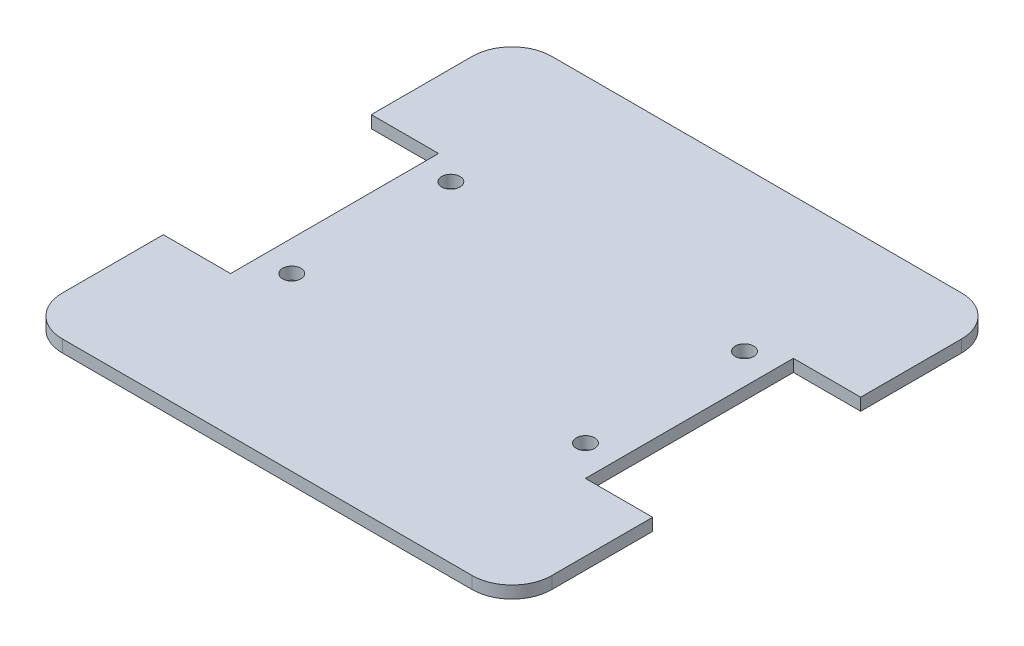
ISO-10303-21;
HEADER;
FILE_DESCRIPTION(('STEP AP214'),'2;1');
FILE_NAME('part.step','',(''),(''),'','','');
FILE_SCHEMA(('AUTOMOTIVE_DESIGN { 1 0 10303 214 1 1 1 1 }'));
ENDSEC;
DATA;
#1=APPLICATION_CONTEXT('core data for automotive mechanical design processes');
#2=APPLICATION_PROTOCOL_DEFINITION('international standard','automotive_design',2000,#1);
#3=PRODUCT_CONTEXT('',#1,'mechanical');
#4=PRODUCT('Part','Part','',(#3));
#5=PRODUCT_RELATED_PRODUCT_CATEGORY('part','',(#4));
#6=PRODUCT_DEFINITION_FORMATION('','',#4);
#7=PRODUCT_DEFINITION_CONTEXT('part definition',#1,'design');
#8=PRODUCT_DEFINITION('design','',#6,#7);
#9=PRODUCT_DEFINITION_SHAPE('','',#8);
#10=(LENGTH_UNIT() NAMED_UNIT(*) SI_UNIT(.MILLI.,.METRE.));
#11=(NAMED_UNIT(*) PLANE_ANGLE_UNIT() SI_UNIT($,.RADIAN.));
#12=(NAMED_UNIT(*) SI_UNIT($,.STERADIAN.) SOLID_ANGLE_UNIT());
#13=UNCERTAINTY_MEASURE_WITH_UNIT(LENGTH_MEASURE(1.E-05),#10,'distance_accuracy_value','');
#14=(GEOMETRIC_REPRESENTATION_CONTEXT(3) GLOBAL_UNCERTAINTY_ASSIGNED_CONTEXT((#13)) GLOBAL_UNIT_ASSIGNED_CONTEXT((#10,
#11,#12)) REPRESENTATION_CONTEXT('',''));
#15=CARTESIAN_POINT('',(0.,0.,0.));
#16=DIRECTION('',(0.,0.,1.));
#17=DIRECTION('',(1.,0.,0.));
#18=AXIS2_PLACEMENT_3D('',#15,#16,#17);
#19=CARTESIAN_POINT('',(6.5,2.,-6.5));
#20=DIRECTION('',(0.,-1.,0.));
#21=DIRECTION('',(0.,0.,-1.));
#22=AXIS2_PLACEMENT_3D('',#19,#20,#21);
#23=PLANE('',#22);
#24=CARTESIAN_POINT('',(6.5,2.,-6.5));
#25=DIRECTION('',(0.,1.,0.));
#26=DIRECTION('',(0.,0.,-1.));
#27=AXIS2_PLACEMENT_3D('',#24,#25,#26);
#28=CIRCLE('',#27,6.5);
#29=CARTESIAN_POINT('',(0.,2.,-6.50000000000005));
#30=VERTEX_POINT('',#29);
#31=CARTESIAN_POINT('',(6.50000000000005,2.,0.));
#32=VERTEX_POINT('',#31);
#33=EDGE_CURVE('E238',#30,#32,#28,.T.);
#34=ORIENTED_EDGE('',*,*,#33,.T.);
#35=DIRECTION('',(1.,0.,0.));
#36=VECTOR('',#35,1.);
#37=CARTESIAN_POINT('',(6.50000000000005,2.,0.));
#38=LINE('',#37,#36);
#39=CARTESIAN_POINT('',(73.5,2.,0.));
#40=VERTEX_POINT('',#39);
#41=EDGE_CURVE('E126',#32,#40,#38,.T.);
#42=ORIENTED_EDGE('',*,*,#41,.T.);
#43=CARTESIAN_POINT('',(73.5,2.,-6.5));
#44=DIRECTION('',(0.,1.,0.));
#45=DIRECTION('',(0.,0.,-1.));
#46=AXIS2_PLACEMENT_3D('',#43,#44,#45);
#47=CIRCLE('',#46,6.5);
#48=CARTESIAN_POINT('',(80.,2.,-6.50000000000005));
#49=VERTEX_POINT('',#48);
#50=EDGE_CURVE('E291',#40,#49,#47,.T.);
#51=ORIENTED_EDGE('',*,*,#50,.T.);
#52=DIRECTION('',(0.,0.,-1.));
#53=VECTOR('',#52,1.);
#54=CARTESIAN_POINT('',(80.,2.,-6.50000000000005));
#55=LINE('',#54,#53);
#56=CARTESIAN_POINT('',(80.,2.,-23.));
#57=VERTEX_POINT('',#56);
#58=EDGE_CURVE('E311',#49,#57,#55,.T.);
#59=ORIENTED_EDGE('',*,*,#58,.T.);
#60=DIRECTION('',(-1.,0.,0.));
#61=VECTOR('',#60,1.);
#62=CARTESIAN_POINT('',(69.,2.,-23.));
#63=LINE('',#62,#61);
#64=CARTESIAN_POINT('',(69.,2.,-23.));
#65=VERTEX_POINT('',#64);
#66=EDGE_CURVE('E307',#57,#65,#63,.T.);
#67=ORIENTED_EDGE('',*,*,#66,.T.);
#68=DIRECTION('',(0.,0.,-1.));
#69=VECTOR('',#68,1.);
#70=CARTESIAN_POINT('',(69.,2.,-23.));
#71=LINE('',#70,#69);
#72=CARTESIAN_POINT('',(69.,2.,-57.));
#73=VERTEX_POINT('',#72);
#74=EDGE_CURVE('E310',#65,#73,#71,.T.);
#75=ORIENTED_EDGE('',*,*,#74,.T.);
#76=DIRECTION('',(1.,0.,0.));
#77=VECTOR('',#76,1.);
#78=CARTESIAN_POINT('',(69.,2.,-57.));
#79=LINE('',#78,#77);
#80=CARTESIAN_POINT('',(80.,2.,-57.));
#81=VERTEX_POINT('',#80);
#82=EDGE_CURVE('E315',#73,#81,#79,.T.);
#83=ORIENTED_EDGE('',*,*,#82,.T.);
#84=DIRECTION('',(0.,0.,-1.));
#85=VECTOR('',#84,1.);
#86=CARTESIAN_POINT('',(80.,2.,-57.));
#87=LINE('',#86,#85);
#88=CARTESIAN_POINT('',(80.,2.,-73.5));
#89=VERTEX_POINT('',#88);
#90=EDGE_CURVE('E322',#81,#89,#87,.T.);
#91=ORIENTED_EDGE('',*,*,#90,.T.);
#92=CARTESIAN_POINT('',(73.5,2.,-73.5));
#93=DIRECTION('',(0.,1.,0.));
#94=DIRECTION('',(0.,0.,-1.));
#95=AXIS2_PLACEMENT_3D('',#92,#93,#94);
#96=CIRCLE('',#95,6.5);
#97=CARTESIAN_POINT('',(73.5,2.,-80.));
#98=VERTEX_POINT('',#97);
#99=EDGE_CURVE('E325',#89,#98,#96,.T.);
#100=ORIENTED_EDGE('',*,*,#99,.T.);
#101=DIRECTION('',(-1.,0.,0.));
#102=VECTOR('',#101,1.);
#103=CARTESIAN_POINT('',(73.5,2.,-80.));
#104=LINE('',#103,#102);
#105=CARTESIAN_POINT('',(6.50000000000005,2.,-80.));
#106=VERTEX_POINT('',#105);
#107=EDGE_CURVE('E328',#98,#106,#104,.T.);
#108=ORIENTED_EDGE('',*,*,#107,.T.);
#109=CARTESIAN_POINT('',(6.50000000000001,2.,-73.5));
#110=DIRECTION('',(0.,1.,0.));
#111=DIRECTION('',(0.,0.,1.));
#112=AXIS2_PLACEMENT_3D('',#109,#110,#111);
#113=CIRCLE('',#112,6.5);
#114=CARTESIAN_POINT('',(0.,2.,-73.4999999999999));
#115=VERTEX_POINT('',#114);
#116=EDGE_CURVE('E331',#106,#115,#113,.T.);
#117=ORIENTED_EDGE('',*,*,#116,.T.);
#118=DIRECTION('',(0.,0.,1.));
#119=VECTOR('',#118,1.);
#120=CARTESIAN_POINT('',(0.,2.,-73.4999999999999));
#121=LINE('',#120,#119);
#122=CARTESIAN_POINT('',(0.,2.,-57.));
#123=VERTEX_POINT('',#122);
#124=EDGE_CURVE('E334',#115,#123,#121,.T.);
#125=ORIENTED_EDGE('',*,*,#124,.T.);
#126=DIRECTION('',(1.,0.,0.));
#127=VECTOR('',#126,1.);
#128=CARTESIAN_POINT('',(11.,2.,-57.));
#129=LINE('',#128,#127);
#130=CARTESIAN_POINT('',(11.,2.,-57.));
#131=VERTEX_POINT('',#130);
#132=EDGE_CURVE('E169',#123,#131,#129,.T.);
#133=ORIENTED_EDGE('',*,*,#132,.T.);
#134=DIRECTION('',(0.,0.,1.));
#135=VECTOR('',#134,1.);
#136=CARTESIAN_POINT('',(11.,2.,-23.));
#137=LINE('',#136,#135);
#138=CARTESIAN_POINT('',(11.,2.,-23.));
#139=VERTEX_POINT('',#138);
#140=EDGE_CURVE('E163',#131,#139,#137,.T.);
#141=ORIENTED_EDGE('',*,*,#140,.T.);
#142=DIRECTION('',(-1.,0.,0.));
#143=VECTOR('',#142,1.);
#144=CARTESIAN_POINT('',(11.,2.,-23.));
#145=LINE('',#144,#143);
#146=CARTESIAN_POINT('',(0.,2.,-23.));
#147=VERTEX_POINT('',#146);
#148=EDGE_CURVE('E167',#139,#147,#145,.T.);
#149=ORIENTED_EDGE('',*,*,#148,.T.);
#150=DIRECTION('',(0.,0.,1.));
#151=VECTOR('',#150,1.);
#152=CARTESIAN_POINT('',(0.,2.,-23.));
#153=LINE('',#152,#151);
#154=EDGE_CURVE('E59',#147,#30,#153,.T.);
#155=ORIENTED_EDGE('',*,*,#154,.T.);
#156=EDGE_LOOP('',(#34,#42,#51,#59,#67,#75,#83,#91,#100,#108,#117,#125,#133,#141,#149,#155));
#157=FACE_BOUND('',#156,.T.);
#158=CARTESIAN_POINT('',(16.,2.,-54.));
#159=DIRECTION('',(0.,1.,0.));
#160=DIRECTION('',(0.,0.,1.));
#161=AXIS2_PLACEMENT_3D('',#158,#159,#160);
#162=CIRCLE('',#161,1.5);
#163=CARTESIAN_POINT('',(16.,2.,-52.5));
#164=VERTEX_POINT('',#163);
#165=EDGE_CURVE('E196',#164,#164,#162,.T.);
#166=ORIENTED_EDGE('',*,*,#165,.F.);
#167=EDGE_LOOP('',(#166));
#168=FACE_BOUND('',#167,.T.);
#169=CARTESIAN_POINT('',(16.,2.,-28.));
#170=DIRECTION('',(0.,1.,0.));
#171=DIRECTION('',(0.,0.,1.));
#172=AXIS2_PLACEMENT_3D('',#169,#170,#171);
#173=CIRCLE('',#172,1.5);
#174=CARTESIAN_POINT('',(16.,2.,-26.5));
#175=VERTEX_POINT('',#174);
#176=EDGE_CURVE('E404',#175,#175,#173,.T.);
#177=ORIENTED_EDGE('',*,*,#176,.F.);
#178=EDGE_LOOP('',(#177));
#179=FACE_BOUND('',#178,.T.);
#180=CARTESIAN_POINT('',(64.,2.,-28.));
#181=DIRECTION('',(0.,1.,0.));
#182=DIRECTION('',(0.,0.,-1.));
#183=AXIS2_PLACEMENT_3D('',#180,#181,#182);
#184=CIRCLE('',#183,1.50000000000001);
#185=CARTESIAN_POINT('',(64.,2.,-29.5));
#186=VERTEX_POINT('',#185);
#187=EDGE_CURVE('E396',#186,#186,#184,.T.);
#188=ORIENTED_EDGE('',*,*,#187,.F.);
#189=EDGE_LOOP('',(#188));
#190=FACE_BOUND('',#189,.T.);
#191=CARTESIAN_POINT('',(64.,2.,-54.));
#192=DIRECTION('',(0.,1.,0.));
#193=DIRECTION('',(0.,0.,-1.));
#194=AXIS2_PLACEMENT_3D('',#191,#192,#193);
#195=CIRCLE('',#194,1.5);
#196=CARTESIAN_POINT('',(64.,2.,-55.5));
#197=VERTEX_POINT('',#196);
#198=EDGE_CURVE('E385',#197,#197,#195,.T.);
#199=ORIENTED_EDGE('',*,*,#198,.F.);
#200=EDGE_LOOP('',(#199));
#201=FACE_BOUND('',#200,.T.);
#202=ADVANCED_FACE('F41',(#157,#168,#179,#190,#201),#23,.F.);
#203=CARTESIAN_POINT('',(6.5,0.,-6.5));
#204=DIRECTION('',(0.,-1.,0.));
#205=DIRECTION('',(0.,0.,-1.));
#206=AXIS2_PLACEMENT_3D('',#203,#204,#205);
#207=PLANE('',#206);
#208=CARTESIAN_POINT('',(64.,0.,-28.));
#209=DIRECTION('',(0.,1.,0.));
#210=DIRECTION('',(0.,0.,-1.));
#211=AXIS2_PLACEMENT_3D('',#208,#209,#210);
#212=CIRCLE('',#211,1.50000000000001);
#213=CARTESIAN_POINT('',(64.,0.,-29.5));
#214=VERTEX_POINT('',#213);
#215=EDGE_CURVE('E393',#214,#214,#212,.T.);
#216=ORIENTED_EDGE('',*,*,#215,.T.);
#217=EDGE_LOOP('',(#216));
#218=FACE_BOUND('',#217,.T.);
#219=CARTESIAN_POINT('',(16.,0.,-54.));
#220=DIRECTION('',(0.,1.,0.));
#221=DIRECTION('',(0.,0.,1.));
#222=AXIS2_PLACEMENT_3D('',#219,#220,#221);
#223=CIRCLE('',#222,1.5);
#224=CARTESIAN_POINT('',(16.,0.,-52.5));
#225=VERTEX_POINT('',#224);
#226=EDGE_CURVE('E408',#225,#225,#223,.T.);
#227=ORIENTED_EDGE('',*,*,#226,.T.);
#228=EDGE_LOOP('',(#227));
#229=FACE_BOUND('',#228,.T.);
#230=CARTESIAN_POINT('',(6.5,0.,-6.5));
#231=DIRECTION('',(0.,1.,0.));
#232=DIRECTION('',(0.,0.,-1.));
#233=AXIS2_PLACEMENT_3D('',#230,#231,#232);
#234=CIRCLE('',#233,6.5);
#235=CARTESIAN_POINT('',(0.,0.,-6.50000000000005));
#236=VERTEX_POINT('',#235);
#237=CARTESIAN_POINT('',(6.50000000000005,0.,0.));
#238=VERTEX_POINT('',#237);
#239=EDGE_CURVE('E191',#236,#238,#234,.T.);
#240=ORIENTED_EDGE('',*,*,#239,.F.);
#241=DIRECTION('',(0.,0.,1.));
#242=VECTOR('',#241,1.);
#243=CARTESIAN_POINT('',(0.,0.,-23.));
#244=LINE('',#243,#242);
#245=CARTESIAN_POINT('',(0.,0.,-23.));
#246=VERTEX_POINT('',#245);
#247=EDGE_CURVE('E118',#246,#236,#244,.T.);
#248=ORIENTED_EDGE('',*,*,#247,.F.);
#249=DIRECTION('',(-1.,0.,0.));
#250=VECTOR('',#249,1.);
#251=CARTESIAN_POINT('',(11.,0.,-23.));
#252=LINE('',#251,#250);
#253=CARTESIAN_POINT('',(11.,0.,-23.));
#254=VERTEX_POINT('',#253);
#255=EDGE_CURVE('E112',#254,#246,#252,.T.);
#256=ORIENTED_EDGE('',*,*,#255,.F.);
#257=DIRECTION('',(0.,0.,1.));
#258=VECTOR('',#257,1.);
#259=CARTESIAN_POINT('',(11.,0.,-23.));
#260=LINE('',#259,#258);
#261=CARTESIAN_POINT('',(11.,0.,-57.));
#262=VERTEX_POINT('',#261);
#263=EDGE_CURVE('E178',#262,#254,#260,.T.);
#264=ORIENTED_EDGE('',*,*,#263,.F.);
#265=DIRECTION('',(1.,0.,0.));
#266=VECTOR('',#265,1.);
#267=CARTESIAN_POINT('',(11.,0.,-57.));
#268=LINE('',#267,#266);
#269=CARTESIAN_POINT('',(0.,0.,-57.));
#270=VERTEX_POINT('',#269);
#271=EDGE_CURVE('E229',#270,#262,#268,.T.);
#272=ORIENTED_EDGE('',*,*,#271,.F.);
#273=DIRECTION('',(0.,0.,1.));
#274=VECTOR('',#273,1.);
#275=CARTESIAN_POINT('',(0.,0.,-73.4999999999999));
#276=LINE('',#275,#274);
#277=CARTESIAN_POINT('',(0.,0.,-73.4999999999999));
#278=VERTEX_POINT('',#277);
#279=EDGE_CURVE('E226',#278,#270,#276,.T.);
#280=ORIENTED_EDGE('',*,*,#279,.F.);
#281=CARTESIAN_POINT('',(6.50000000000001,0.,-73.5));
#282=DIRECTION('',(0.,1.,0.));
#283=DIRECTION('',(0.,0.,1.));
#284=AXIS2_PLACEMENT_3D('',#281,#282,#283);
#285=CIRCLE('',#284,6.5);
#286=CARTESIAN_POINT('',(6.50000000000005,0.,-80.));
#287=VERTEX_POINT('',#286);
#288=EDGE_CURVE('E223',#287,#278,#285,.T.);
#289=ORIENTED_EDGE('',*,*,#288,.F.);
#290=DIRECTION('',(-1.,0.,0.));
#291=VECTOR('',#290,1.);
#292=CARTESIAN_POINT('',(73.5,0.,-80.));
#293=LINE('',#292,#291);
#294=CARTESIAN_POINT('',(73.5,0.,-80.));
#295=VERTEX_POINT('',#294);
#296=EDGE_CURVE('E220',#295,#287,#293,.T.);
#297=ORIENTED_EDGE('',*,*,#296,.F.);
#298=CARTESIAN_POINT('',(73.5,0.,-73.5));
#299=DIRECTION('',(0.,1.,0.));
#300=DIRECTION('',(0.,0.,-1.));
#301=AXIS2_PLACEMENT_3D('',#298,#299,#300);
#302=CIRCLE('',#301,6.5);
#303=CARTESIAN_POINT('',(80.,0.,-73.5));
#304=VERTEX_POINT('',#303);
#305=EDGE_CURVE('E217',#304,#295,#302,.T.);
#306=ORIENTED_EDGE('',*,*,#305,.F.);
#307=DIRECTION('',(0.,0.,-1.));
#308=VECTOR('',#307,1.);
#309=CARTESIAN_POINT('',(80.,0.,-57.));
#310=LINE('',#309,#308);
#311=CARTESIAN_POINT('',(80.,0.,-57.));
#312=VERTEX_POINT('',#311);
#313=EDGE_CURVE('E214',#312,#304,#310,.T.);
#314=ORIENTED_EDGE('',*,*,#313,.F.);
#315=DIRECTION('',(1.,0.,0.));
#316=VECTOR('',#315,1.);
#317=CARTESIAN_POINT('',(69.,0.,-57.));
#318=LINE('',#317,#316);
#319=CARTESIAN_POINT('',(69.,0.,-57.));
#320=VERTEX_POINT('',#319);
#321=EDGE_CURVE('E211',#320,#312,#318,.T.);
#322=ORIENTED_EDGE('',*,*,#321,.F.);
#323=DIRECTION('',(0.,0.,-1.));
#324=VECTOR('',#323,1.);
#325=CARTESIAN_POINT('',(69.,0.,-23.));
#326=LINE('',#325,#324);
#327=CARTESIAN_POINT('',(69.,0.,-23.));
#328=VERTEX_POINT('',#327);
#329=EDGE_CURVE('E208',#328,#320,#326,.T.);
#330=ORIENTED_EDGE('',*,*,#329,.F.);
#331=DIRECTION('',(-1.,0.,0.));
#332=VECTOR('',#331,1.);
#333=CARTESIAN_POINT('',(69.,0.,-23.));
#334=LINE('',#333,#332);
#335=CARTESIAN_POINT('',(80.,0.,-23.));
#336=VERTEX_POINT('',#335);
#337=EDGE_CURVE('E205',#336,#328,#334,.T.);
#338=ORIENTED_EDGE('',*,*,#337,.F.);
#339=DIRECTION('',(0.,0.,-1.));
#340=VECTOR('',#339,1.);
#341=CARTESIAN_POINT('',(80.,0.,-6.50000000000005));
#342=LINE('',#341,#340);
#343=CARTESIAN_POINT('',(80.,0.,-6.50000000000005));
#344=VERTEX_POINT('',#343);
#345=EDGE_CURVE('E202',#344,#336,#342,.T.);
#346=ORIENTED_EDGE('',*,*,#345,.F.);
#347=CARTESIAN_POINT('',(73.5,0.,-6.5));
#348=DIRECTION('',(0.,1.,0.));
#349=DIRECTION('',(0.,0.,-1.));
#350=AXIS2_PLACEMENT_3D('',#347,#348,#349);
#351=CIRCLE('',#350,6.5);
#352=CARTESIAN_POINT('',(73.5,0.,0.));
#353=VERTEX_POINT('',#352);
#354=EDGE_CURVE('E199',#353,#344,#351,.T.);
#355=ORIENTED_EDGE('',*,*,#354,.F.);
#356=DIRECTION('',(1.,0.,0.));
#357=VECTOR('',#356,1.);
#358=CARTESIAN_POINT('',(6.50000000000005,0.,0.));
#359=LINE('',#358,#357);
#360=EDGE_CURVE('E195',#238,#353,#359,.T.);
#361=ORIENTED_EDGE('',*,*,#360,.F.);
#362=EDGE_LOOP('',(#240,#248,#256,#264,#272,#280,#289,#297,#306,#314,#322,#330,#338,#346,#355,#361));
#363=FACE_BOUND('',#362,.T.);
#364=CARTESIAN_POINT('',(16.,0.,-28.));
#365=DIRECTION('',(0.,1.,0.));
#366=DIRECTION('',(0.,0.,1.));
#367=AXIS2_PLACEMENT_3D('',#364,#365,#366);
#368=CIRCLE('',#367,1.5);
#369=CARTESIAN_POINT('',(16.,0.,-26.5));
#370=VERTEX_POINT('',#369);
#371=EDGE_CURVE('E400',#370,#370,#368,.T.);
#372=ORIENTED_EDGE('',*,*,#371,.T.);
#373=EDGE_LOOP('',(#372));
#374=FACE_BOUND('',#373,.T.);
#375=CARTESIAN_POINT('',(64.,0.,-54.));
#376=DIRECTION('',(0.,1.,0.));
#377=DIRECTION('',(0.,0.,-1.));
#378=AXIS2_PLACEMENT_3D('',#375,#376,#377);
#379=CIRCLE('',#378,1.5);
#380=CARTESIAN_POINT('',(64.,0.,-55.5));
#381=VERTEX_POINT('',#380);
#382=EDGE_CURVE('E388',#381,#381,#379,.T.);
#383=ORIENTED_EDGE('',*,*,#382,.T.);
#384=EDGE_LOOP('',(#383));
#385=FACE_BOUND('',#384,.T.);
#386=ADVANCED_FACE('F295',(#218,#229,#363,#374,#385),#207,.T.);
#387=CARTESIAN_POINT('',(6.5,2.,-6.5));
#388=DIRECTION('',(0.,-1.,0.));
#389=DIRECTION('',(0.,0.,-1.));
#390=AXIS2_PLACEMENT_3D('',#387,#388,#389);
#391=CYLINDRICAL_SURFACE('',#390,6.5);
#392=ORIENTED_EDGE('',*,*,#239,.T.);
#393=DIRECTION('',(0.,-1.,0.));
#394=VECTOR('',#393,1.);
#395=CARTESIAN_POINT('',(6.50000000000005,2.,0.));
#396=LINE('',#395,#394);
#397=EDGE_CURVE('E11',#32,#238,#396,.T.);
#398=ORIENTED_EDGE('',*,*,#397,.F.);
#399=ORIENTED_EDGE('',*,*,#33,.F.);
#400=DIRECTION('',(0.,-1.,0.));
#401=VECTOR('',#400,1.);
#402=CARTESIAN_POINT('',(0.,2.,-6.50000000000005));
#403=LINE('',#402,#401);
#404=EDGE_CURVE('E187',#30,#236,#403,.T.);
#405=ORIENTED_EDGE('',*,*,#404,.T.);
#406=EDGE_LOOP('',(#392,#398,#399,#405));
#407=FACE_BOUND('',#406,.T.);
#408=ADVANCED_FACE('F43',(#407),#391,.T.);
#409=CARTESIAN_POINT('',(6.50000000000005,2.,0.));
#410=DIRECTION('',(0.,0.,-1.));
#411=DIRECTION('',(-1.,0.,0.));
#412=AXIS2_PLACEMENT_3D('',#409,#410,#411);
#413=PLANE('',#412);
#414=ORIENTED_EDGE('',*,*,#360,.T.);
#415=DIRECTION('',(0.,-1.,0.));
#416=VECTOR('',#415,1.);
#417=CARTESIAN_POINT('',(73.5,2.,0.));
#418=LINE('',#417,#416);
#419=EDGE_CURVE('E51',#40,#353,#418,.T.);
#420=ORIENTED_EDGE('',*,*,#419,.F.);
#421=ORIENTED_EDGE('',*,*,#41,.F.);
#422=ORIENTED_EDGE('',*,*,#397,.T.);
#423=EDGE_LOOP('',(#414,#420,#421,#422));
#424=FACE_BOUND('',#423,.T.);
#425=ADVANCED_FACE('F566',(#424),#413,.F.);
#426=CARTESIAN_POINT('',(73.5,2.,-6.5));
#427=DIRECTION('',(0.,-1.,0.));
#428=DIRECTION('',(0.,0.,-1.));
#429=AXIS2_PLACEMENT_3D('',#426,#427,#428);
#430=CYLINDRICAL_SURFACE('',#429,6.5);
#431=ORIENTED_EDGE('',*,*,#354,.T.);
#432=DIRECTION('',(0.,-1.,0.));
#433=VECTOR('',#432,1.);
#434=CARTESIAN_POINT('',(80.,2.,-6.50000000000005));
#435=LINE('',#434,#433);
#436=EDGE_CURVE('E281',#49,#344,#435,.T.);
#437=ORIENTED_EDGE('',*,*,#436,.F.);
#438=ORIENTED_EDGE('',*,*,#50,.F.);
#439=ORIENTED_EDGE('',*,*,#419,.T.);
#440=EDGE_LOOP('',(#431,#437,#438,#439));
#441=FACE_BOUND('',#440,.T.);
#442=ADVANCED_FACE('F289',(#441),#430,.T.);
#443=CARTESIAN_POINT('',(80.,2.,-6.50000000000005));
#444=DIRECTION('',(-1.,0.,0.));
#445=DIRECTION('',(0.,0.,1.));
#446=AXIS2_PLACEMENT_3D('',#443,#444,#445);
#447=PLANE('',#446);
#448=ORIENTED_EDGE('',*,*,#345,.T.);
#449=DIRECTION('',(0.,-1.,0.));
#450=VECTOR('',#449,1.);
#451=CARTESIAN_POINT('',(80.,2.,-23.));
#452=LINE('',#451,#450);
#453=EDGE_CURVE('E277',#57,#336,#452,.T.);
#454=ORIENTED_EDGE('',*,*,#453,.F.);
#455=ORIENTED_EDGE('',*,*,#58,.F.);
#456=ORIENTED_EDGE('',*,*,#436,.T.);
#457=EDGE_LOOP('',(#448,#454,#455,#456));
#458=FACE_BOUND('',#457,.T.);
#459=ADVANCED_FACE('F301',(#458),#447,.F.);
#460=CARTESIAN_POINT('',(69.,2.,-23.));
#461=DIRECTION('',(0.,0.,1.));
#462=DIRECTION('',(1.,0.,0.));
#463=AXIS2_PLACEMENT_3D('',#460,#461,#462);
#464=PLANE('',#463);
#465=ORIENTED_EDGE('',*,*,#337,.T.);
#466=DIRECTION('',(0.,-1.,0.));
#467=VECTOR('',#466,1.);
#468=CARTESIAN_POINT('',(69.,2.,-23.));
#469=LINE('',#468,#467);
#470=EDGE_CURVE('E273',#65,#328,#469,.T.);
#471=ORIENTED_EDGE('',*,*,#470,.F.);
#472=ORIENTED_EDGE('',*,*,#66,.F.);
#473=ORIENTED_EDGE('',*,*,#453,.T.);
#474=EDGE_LOOP('',(#465,#471,#472,#473));
#475=FACE_BOUND('',#474,.T.);
#476=ADVANCED_FACE('F305',(#475),#464,.F.);
#477=CARTESIAN_POINT('',(69.,2.,-23.));
#478=DIRECTION('',(-1.,0.,0.));
#479=DIRECTION('',(0.,0.,1.));
#480=AXIS2_PLACEMENT_3D('',#477,#478,#479);
#481=PLANE('',#480);
#482=ORIENTED_EDGE('',*,*,#329,.T.);
#483=DIRECTION('',(0.,-1.,0.));
#484=VECTOR('',#483,1.);
#485=CARTESIAN_POINT('',(69.,2.,-57.));
#486=LINE('',#485,#484);
#487=EDGE_CURVE('E269',#73,#320,#486,.T.);
#488=ORIENTED_EDGE('',*,*,#487,.F.);
#489=ORIENTED_EDGE('',*,*,#74,.F.);
#490=ORIENTED_EDGE('',*,*,#470,.T.);
#491=EDGE_LOOP('',(#482,#488,#489,#490));
#492=FACE_BOUND('',#491,.T.);
#493=ADVANCED_FACE('F531',(#492),#481,.F.);
#494=CARTESIAN_POINT('',(69.,2.,-57.));
#495=DIRECTION('',(0.,0.,-1.));
#496=DIRECTION('',(-1.,0.,0.));
#497=AXIS2_PLACEMENT_3D('',#494,#495,#496);
#498=PLANE('',#497);
#499=ORIENTED_EDGE('',*,*,#321,.T.);
#500=DIRECTION('',(0.,-1.,0.));
#501=VECTOR('',#500,1.);
#502=CARTESIAN_POINT('',(80.,2.,-57.));
#503=LINE('',#502,#501);
#504=EDGE_CURVE('E265',#81,#312,#503,.T.);
#505=ORIENTED_EDGE('',*,*,#504,.F.);
#506=ORIENTED_EDGE('',*,*,#82,.F.);
#507=ORIENTED_EDGE('',*,*,#487,.T.);
#508=EDGE_LOOP('',(#499,#505,#506,#507));
#509=FACE_BOUND('',#508,.T.);
#510=ADVANCED_FACE('F521',(#509),#498,.F.);
#511=CARTESIAN_POINT('',(80.,2.,-57.));
#512=DIRECTION('',(-1.,0.,0.));
#513=DIRECTION('',(0.,0.,1.));
#514=AXIS2_PLACEMENT_3D('',#511,#512,#513);
#515=PLANE('',#514);
#516=ORIENTED_EDGE('',*,*,#313,.T.);
#517=DIRECTION('',(0.,-1.,0.));
#518=VECTOR('',#517,1.);
#519=CARTESIAN_POINT('',(80.,2.,-73.5));
#520=LINE('',#519,#518);
#521=EDGE_CURVE('E261',#89,#304,#520,.T.);
#522=ORIENTED_EDGE('',*,*,#521,.F.);
#523=ORIENTED_EDGE('',*,*,#90,.F.);
#524=ORIENTED_EDGE('',*,*,#504,.T.);
#525=EDGE_LOOP('',(#516,#522,#523,#524));
#526=FACE_BOUND('',#525,.T.);
#527=ADVANCED_FACE('F511',(#526),#515,.F.);
#528=CARTESIAN_POINT('',(73.5,2.,-73.5));
#529=DIRECTION('',(0.,-1.,0.));
#530=DIRECTION('',(0.,0.,-1.));
#531=AXIS2_PLACEMENT_3D('',#528,#529,#530);
#532=CYLINDRICAL_SURFACE('',#531,6.5);
#533=ORIENTED_EDGE('',*,*,#305,.T.);
#534=DIRECTION('',(0.,-1.,0.));
#535=VECTOR('',#534,1.);
#536=CARTESIAN_POINT('',(73.5,2.,-80.));
#537=LINE('',#536,#535);
#538=EDGE_CURVE('E257',#98,#295,#537,.T.);
#539=ORIENTED_EDGE('',*,*,#538,.F.);
#540=ORIENTED_EDGE('',*,*,#99,.F.);
#541=ORIENTED_EDGE('',*,*,#521,.T.);
#542=EDGE_LOOP('',(#533,#539,#540,#541));
#543=FACE_BOUND('',#542,.T.);
#544=ADVANCED_FACE('F501',(#543),#532,.T.);
#545=CARTESIAN_POINT('',(73.5,2.,-80.));
#546=DIRECTION('',(0.,0.,1.));
#547=DIRECTION('',(1.,0.,0.));
#548=AXIS2_PLACEMENT_3D('',#545,#546,#547);
#549=PLANE('',#548);
#550=ORIENTED_EDGE('',*,*,#296,.T.);
#551=DIRECTION('',(0.,-1.,0.));
#552=VECTOR('',#551,1.);
#553=CARTESIAN_POINT('',(6.50000000000005,2.,-80.));
#554=LINE('',#553,#552);
#555=EDGE_CURVE('E253',#106,#287,#554,.T.);
#556=ORIENTED_EDGE('',*,*,#555,.F.);
#557=ORIENTED_EDGE('',*,*,#107,.F.);
#558=ORIENTED_EDGE('',*,*,#538,.T.);
#559=EDGE_LOOP('',(#550,#556,#557,#558));
#560=FACE_BOUND('',#559,.T.);
#561=ADVANCED_FACE('F491',(#560),#549,.F.);
#562=CARTESIAN_POINT('',(6.50000000000001,2.,-73.5));
#563=DIRECTION('',(0.,-1.,0.));
#564=DIRECTION('',(0.,0.,-1.));
#565=AXIS2_PLACEMENT_3D('',#562,#563,#564);
#566=CYLINDRICAL_SURFACE('',#565,6.5);
#567=ORIENTED_EDGE('',*,*,#288,.T.);
#568=DIRECTION('',(0.,-1.,0.));
#569=VECTOR('',#568,1.);
#570=CARTESIAN_POINT('',(0.,2.,-73.4999999999999));
#571=LINE('',#570,#569);
#572=EDGE_CURVE('E249',#115,#278,#571,.T.);
#573=ORIENTED_EDGE('',*,*,#572,.F.);
#574=ORIENTED_EDGE('',*,*,#116,.F.);
#575=ORIENTED_EDGE('',*,*,#555,.T.);
#576=EDGE_LOOP('',(#567,#573,#574,#575));
#577=FACE_BOUND('',#576,.T.);
#578=ADVANCED_FACE('F482',(#577),#566,.T.);
#579=CARTESIAN_POINT('',(0.,2.,-73.4999999999999));
#580=DIRECTION('',(1.,0.,0.));
#581=DIRECTION('',(0.,0.,-1.));
#582=AXIS2_PLACEMENT_3D('',#579,#580,#581);
#583=PLANE('',#582);
#584=ORIENTED_EDGE('',*,*,#279,.T.);
#585=DIRECTION('',(0.,-1.,0.));
#586=VECTOR('',#585,1.);
#587=CARTESIAN_POINT('',(0.,2.,-57.));
#588=LINE('',#587,#586);
#589=EDGE_CURVE('E245',#123,#270,#588,.T.);
#590=ORIENTED_EDGE('',*,*,#589,.F.);
#591=ORIENTED_EDGE('',*,*,#124,.F.);
#592=ORIENTED_EDGE('',*,*,#572,.T.);
#593=EDGE_LOOP('',(#584,#590,#591,#592));
#594=FACE_BOUND('',#593,.T.);
#595=ADVANCED_FACE('F342',(#594),#583,.F.);
#596=CARTESIAN_POINT('',(11.,2.,-57.));
#597=DIRECTION('',(0.,0.,-1.));
#598=DIRECTION('',(-1.,0.,0.));
#599=AXIS2_PLACEMENT_3D('',#596,#597,#598);
#600=PLANE('',#599);
#601=ORIENTED_EDGE('',*,*,#271,.T.);
#602=DIRECTION('',(0.,-1.,0.));
#603=VECTOR('',#602,1.);
#604=CARTESIAN_POINT('',(11.,2.,-57.));
#605=LINE('',#604,#603);
#606=EDGE_CURVE('E180',#131,#262,#605,.T.);
#607=ORIENTED_EDGE('',*,*,#606,.F.);
#608=ORIENTED_EDGE('',*,*,#132,.F.);
#609=ORIENTED_EDGE('',*,*,#589,.T.);
#610=EDGE_LOOP('',(#601,#607,#608,#609));
#611=FACE_BOUND('',#610,.T.);
#612=ADVANCED_FACE('F346',(#611),#600,.F.);
#613=CARTESIAN_POINT('',(11.,2.,-23.));
#614=DIRECTION('',(1.,0.,0.));
#615=DIRECTION('',(0.,0.,-1.));
#616=AXIS2_PLACEMENT_3D('',#613,#614,#615);
#617=PLANE('',#616);
#618=ORIENTED_EDGE('',*,*,#263,.T.);
#619=DIRECTION('',(0.,-1.,0.));
#620=VECTOR('',#619,1.);
#621=CARTESIAN_POINT('',(11.,2.,-23.));
#622=LINE('',#621,#620);
#623=EDGE_CURVE('E175',#139,#254,#622,.T.);
#624=ORIENTED_EDGE('',*,*,#623,.F.);
#625=ORIENTED_EDGE('',*,*,#140,.F.);
#626=ORIENTED_EDGE('',*,*,#606,.T.);
#627=EDGE_LOOP('',(#618,#624,#625,#626));
#628=FACE_BOUND('',#627,.T.);
#629=ADVANCED_FACE('F176',(#628),#617,.F.);
#630=CARTESIAN_POINT('',(11.,2.,-23.));
#631=DIRECTION('',(0.,0.,1.));
#632=DIRECTION('',(1.,0.,0.));
#633=AXIS2_PLACEMENT_3D('',#630,#631,#632);
#634=PLANE('',#633);
#635=ORIENTED_EDGE('',*,*,#255,.T.);
#636=DIRECTION('',(0.,-1.,0.));
#637=VECTOR('',#636,1.);
#638=CARTESIAN_POINT('',(0.,2.,-23.));
#639=LINE('',#638,#637);
#640=EDGE_CURVE('E181',#147,#246,#639,.T.);
#641=ORIENTED_EDGE('',*,*,#640,.F.);
#642=ORIENTED_EDGE('',*,*,#148,.F.);
#643=ORIENTED_EDGE('',*,*,#623,.T.);
#644=EDGE_LOOP('',(#635,#641,#642,#643));
#645=FACE_BOUND('',#644,.T.);
#646=ADVANCED_FACE('F183',(#645),#634,.F.);
#647=CARTESIAN_POINT('',(0.,2.,-23.));
#648=DIRECTION('',(1.,0.,0.));
#649=DIRECTION('',(0.,0.,-1.));
#650=AXIS2_PLACEMENT_3D('',#647,#648,#649);
#651=PLANE('',#650);
#652=ORIENTED_EDGE('',*,*,#247,.T.);
#653=ORIENTED_EDGE('',*,*,#404,.F.);
#654=ORIENTED_EDGE('',*,*,#154,.F.);
#655=ORIENTED_EDGE('',*,*,#640,.T.);
#656=EDGE_LOOP('',(#652,#653,#654,#655));
#657=FACE_BOUND('',#656,.T.);
#658=ADVANCED_FACE('F350',(#657),#651,.F.);
#659=CARTESIAN_POINT('',(16.,2.,-54.));
#660=DIRECTION('',(0.,-1.,0.));
#661=DIRECTION('',(0.,0.,-1.));
#662=AXIS2_PLACEMENT_3D('',#659,#660,#661);
#663=CYLINDRICAL_SURFACE('',#662,1.5);
#664=ORIENTED_EDGE('',*,*,#165,.T.);
#665=EDGE_LOOP('',(#664));
#666=FACE_BOUND('',#665,.T.);
#667=ORIENTED_EDGE('',*,*,#226,.F.);
#668=EDGE_LOOP('',(#667));
#669=FACE_BOUND('',#668,.T.);
#670=ADVANCED_FACE('F352',(#666,#669),#663,.F.);
#671=CARTESIAN_POINT('',(16.,2.,-28.));
#672=DIRECTION('',(0.,-1.,0.));
#673=DIRECTION('',(0.,0.,-1.));
#674=AXIS2_PLACEMENT_3D('',#671,#672,#673);
#675=CYLINDRICAL_SURFACE('',#674,1.5);
#676=ORIENTED_EDGE('',*,*,#176,.T.);
#677=EDGE_LOOP('',(#676));
#678=FACE_BOUND('',#677,.T.);
#679=ORIENTED_EDGE('',*,*,#371,.F.);
#680=EDGE_LOOP('',(#679));
#681=FACE_BOUND('',#680,.T.);
#682=ADVANCED_FACE('F358',(#678,#681),#675,.F.);
#683=CARTESIAN_POINT('',(64.,2.,-28.));
#684=DIRECTION('',(0.,-1.,0.));
#685=DIRECTION('',(0.,0.,-1.));
#686=AXIS2_PLACEMENT_3D('',#683,#684,#685);
#687=CYLINDRICAL_SURFACE('',#686,1.50000000000001);
#688=ORIENTED_EDGE('',*,*,#187,.T.);
#689=EDGE_LOOP('',(#688));
#690=FACE_BOUND('',#689,.T.);
#691=ORIENTED_EDGE('',*,*,#215,.F.);
#692=EDGE_LOOP('',(#691));
#693=FACE_BOUND('',#692,.T.);
#694=ADVANCED_FACE('F372',(#690,#693),#687,.F.);
#695=CARTESIAN_POINT('',(64.,2.,-54.));
#696=DIRECTION('',(0.,-1.,0.));
#697=DIRECTION('',(0.,0.,-1.));
#698=AXIS2_PLACEMENT_3D('',#695,#696,#697);
#699=CYLINDRICAL_SURFACE('',#698,1.5);
#700=ORIENTED_EDGE('',*,*,#198,.T.);
#701=EDGE_LOOP('',(#700));
#702=FACE_BOUND('',#701,.T.);
#703=ORIENTED_EDGE('',*,*,#382,.F.);
#704=EDGE_LOOP('',(#703));
#705=FACE_BOUND('',#704,.T.);
#706=ADVANCED_FACE('F376',(#702,#705),#699,.F.);
#707=CLOSED_SHELL('',(#202,#386,#408,#425,#442,#459,#476,#493,#510,#527,#544,#561,#578,#595,
#612,#629,#646,#658,#670,#682,#694,#706));
#708=MANIFOLD_SOLID_BREP('B2',#707);
#709=ADVANCED_BREP_SHAPE_REPRESENTATION('',(#18,#708),#14);
#710=SHAPE_DEFINITION_REPRESENTATION(#9,#709);
ENDSEC;
END-ISO-10303-21;
